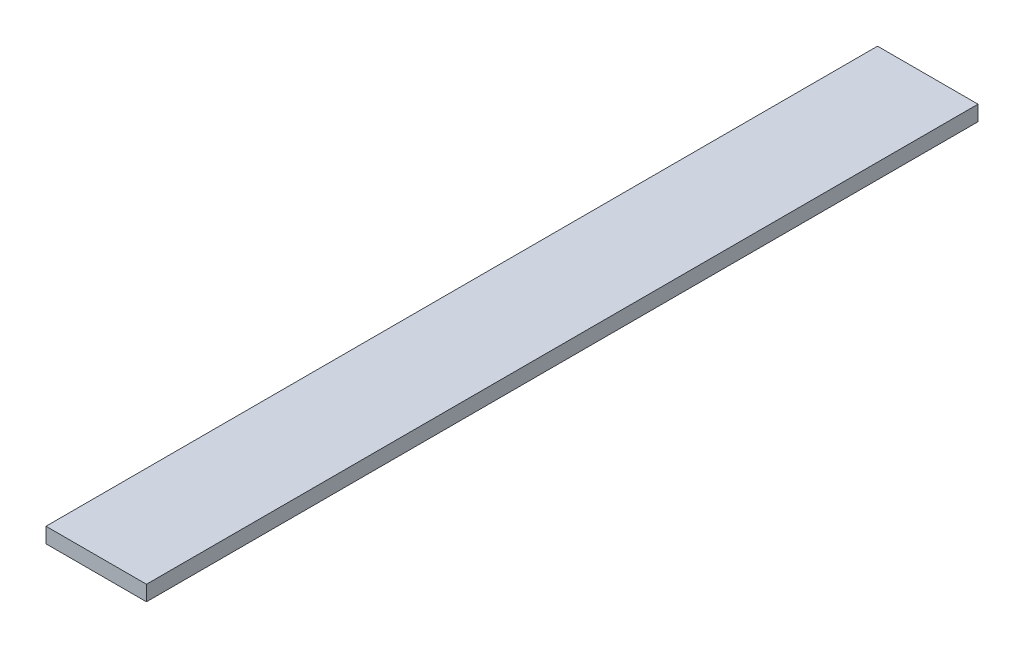
ISO-10303-21;
HEADER;
FILE_DESCRIPTION(('STEP AP214'),'2;1');
FILE_NAME('part.step','',(''),(''),'','','');
FILE_SCHEMA(('AUTOMOTIVE_DESIGN { 1 0 10303 214 1 1 1 1 }'));
ENDSEC;
DATA;
#1=APPLICATION_CONTEXT('core data for automotive mechanical design processes');
#2=APPLICATION_PROTOCOL_DEFINITION('international standard','automotive_design',2000,#1);
#3=PRODUCT_CONTEXT('',#1,'mechanical');
#4=PRODUCT('Part','Part','',(#3));
#5=PRODUCT_RELATED_PRODUCT_CATEGORY('part','',(#4));
#6=PRODUCT_DEFINITION_FORMATION('','',#4);
#7=PRODUCT_DEFINITION_CONTEXT('part definition',#1,'design');
#8=PRODUCT_DEFINITION('design','',#6,#7);
#9=PRODUCT_DEFINITION_SHAPE('','',#8);
#10=(LENGTH_UNIT() NAMED_UNIT(*) SI_UNIT(.MILLI.,.METRE.));
#11=(NAMED_UNIT(*) PLANE_ANGLE_UNIT() SI_UNIT($,.RADIAN.));
#12=(NAMED_UNIT(*) SI_UNIT($,.STERADIAN.) SOLID_ANGLE_UNIT());
#13=UNCERTAINTY_MEASURE_WITH_UNIT(LENGTH_MEASURE(1.E-05),#10,'distance_accuracy_value','');
#14=(GEOMETRIC_REPRESENTATION_CONTEXT(3) GLOBAL_UNCERTAINTY_ASSIGNED_CONTEXT((#13)) GLOBAL_UNIT_ASSIGNED_CONTEXT((#10,
#11,#12)) REPRESENTATION_CONTEXT('',''));
#15=CARTESIAN_POINT('',(0.,0.,0.));
#16=DIRECTION('',(0.,0.,1.));
#17=DIRECTION('',(1.,0.,0.));
#18=AXIS2_PLACEMENT_3D('',#15,#16,#17);
#19=CARTESIAN_POINT('',(72.5,22.,600.));
#20=DIRECTION('',(-1.,0.,0.));
#21=DIRECTION('',(0.,0.,1.));
#22=AXIS2_PLACEMENT_3D('',#19,#20,#21);
#23=PLANE('',#22);
#24=DIRECTION('',(0.,0.,-1.));
#25=VECTOR('',#24,1.);
#26=CARTESIAN_POINT('',(72.5,0.,600.));
#27=LINE('',#26,#25);
#28=CARTESIAN_POINT('',(72.5,0.,600.));
#29=VERTEX_POINT('',#28);
#30=CARTESIAN_POINT('',(72.5,0.,-600.));
#31=VERTEX_POINT('',#30);
#32=EDGE_CURVE('E105',#29,#31,#27,.T.);
#33=ORIENTED_EDGE('',*,*,#32,.T.);
#34=DIRECTION('',(0.,-1.,0.));
#35=VECTOR('',#34,1.);
#36=CARTESIAN_POINT('',(72.5,22.,-600.));
#37=LINE('',#36,#35);
#38=CARTESIAN_POINT('',(72.5,22.,-600.));
#39=VERTEX_POINT('',#38);
#40=EDGE_CURVE('E11',#39,#31,#37,.T.);
#41=ORIENTED_EDGE('',*,*,#40,.F.);
#42=DIRECTION('',(0.,0.,-1.));
#43=VECTOR('',#42,1.);
#44=CARTESIAN_POINT('',(72.5,22.,600.));
#45=LINE('',#44,#43);
#46=CARTESIAN_POINT('',(72.5,22.,600.));
#47=VERTEX_POINT('',#46);
#48=EDGE_CURVE('E88',#47,#39,#45,.T.);
#49=ORIENTED_EDGE('',*,*,#48,.F.);
#50=DIRECTION('',(0.,-1.,0.));
#51=VECTOR('',#50,1.);
#52=CARTESIAN_POINT('',(72.5,22.,600.));
#53=LINE('',#52,#51);
#54=EDGE_CURVE('E101',#47,#29,#53,.T.);
#55=ORIENTED_EDGE('',*,*,#54,.T.);
#56=EDGE_LOOP('',(#33,#41,#49,#55));
#57=FACE_BOUND('',#56,.T.);
#58=ADVANCED_FACE('F36',(#57),#23,.F.);
#59=CARTESIAN_POINT('',(-72.5,22.,-600.));
#60=DIRECTION('',(0.,0.,1.));
#61=DIRECTION('',(1.,0.,0.));
#62=AXIS2_PLACEMENT_3D('',#59,#60,#61);
#63=PLANE('',#62);
#64=DIRECTION('',(-1.,0.,0.));
#65=VECTOR('',#64,1.);
#66=CARTESIAN_POINT('',(-72.5,0.,-600.));
#67=LINE('',#66,#65);
#68=CARTESIAN_POINT('',(-72.5,0.,-600.));
#69=VERTEX_POINT('',#68);
#70=EDGE_CURVE('E93',#31,#69,#67,.T.);
#71=ORIENTED_EDGE('',*,*,#70,.T.);
#72=DIRECTION('',(0.,-1.,0.));
#73=VECTOR('',#72,1.);
#74=CARTESIAN_POINT('',(-72.5,22.,-600.));
#75=LINE('',#74,#73);
#76=CARTESIAN_POINT('',(-72.5,22.,-600.));
#77=VERTEX_POINT('',#76);
#78=EDGE_CURVE('E45',#77,#69,#75,.T.);
#79=ORIENTED_EDGE('',*,*,#78,.F.);
#80=DIRECTION('',(-1.,0.,0.));
#81=VECTOR('',#80,1.);
#82=CARTESIAN_POINT('',(-72.5,22.,-600.));
#83=LINE('',#82,#81);
#84=EDGE_CURVE('E83',#39,#77,#83,.T.);
#85=ORIENTED_EDGE('',*,*,#84,.F.);
#86=ORIENTED_EDGE('',*,*,#40,.T.);
#87=EDGE_LOOP('',(#71,#79,#85,#86));
#88=FACE_BOUND('',#87,.T.);
#89=ADVANCED_FACE('F92',(#88),#63,.F.);
#90=CARTESIAN_POINT('',(-72.5,22.,600.));
#91=DIRECTION('',(1.,0.,0.));
#92=DIRECTION('',(0.,0.,-1.));
#93=AXIS2_PLACEMENT_3D('',#90,#91,#92);
#94=PLANE('',#93);
#95=DIRECTION('',(0.,0.,1.));
#96=VECTOR('',#95,1.);
#97=CARTESIAN_POINT('',(-72.5,0.,600.));
#98=LINE('',#97,#96);
#99=CARTESIAN_POINT('',(-72.5,0.,600.));
#100=VERTEX_POINT('',#99);
#101=EDGE_CURVE('E70',#69,#100,#98,.T.);
#102=ORIENTED_EDGE('',*,*,#101,.T.);
#103=DIRECTION('',(0.,-1.,0.));
#104=VECTOR('',#103,1.);
#105=CARTESIAN_POINT('',(-72.5,22.,600.));
#106=LINE('',#105,#104);
#107=CARTESIAN_POINT('',(-72.5,22.,600.));
#108=VERTEX_POINT('',#107);
#109=EDGE_CURVE('E95',#108,#100,#106,.T.);
#110=ORIENTED_EDGE('',*,*,#109,.F.);
#111=DIRECTION('',(0.,0.,1.));
#112=VECTOR('',#111,1.);
#113=CARTESIAN_POINT('',(-72.5,22.,600.));
#114=LINE('',#113,#112);
#115=EDGE_CURVE('E86',#77,#108,#114,.T.);
#116=ORIENTED_EDGE('',*,*,#115,.F.);
#117=ORIENTED_EDGE('',*,*,#78,.T.);
#118=EDGE_LOOP('',(#102,#110,#116,#117));
#119=FACE_BOUND('',#118,.T.);
#120=ADVANCED_FACE('F96',(#119),#94,.F.);
#121=CARTESIAN_POINT('',(-72.5,22.,600.));
#122=DIRECTION('',(0.,0.,-1.));
#123=DIRECTION('',(-1.,0.,0.));
#124=AXIS2_PLACEMENT_3D('',#121,#122,#123);
#125=PLANE('',#124);
#126=DIRECTION('',(1.,0.,0.));
#127=VECTOR('',#126,1.);
#128=CARTESIAN_POINT('',(-72.5,0.,600.));
#129=LINE('',#128,#127);
#130=EDGE_CURVE('E76',#100,#29,#129,.T.);
#131=ORIENTED_EDGE('',*,*,#130,.T.);
#132=ORIENTED_EDGE('',*,*,#54,.F.);
#133=DIRECTION('',(1.,0.,0.));
#134=VECTOR('',#133,1.);
#135=CARTESIAN_POINT('',(-72.5,22.,600.));
#136=LINE('',#135,#134);
#137=EDGE_CURVE('E53',#108,#47,#136,.T.);
#138=ORIENTED_EDGE('',*,*,#137,.F.);
#139=ORIENTED_EDGE('',*,*,#109,.T.);
#140=EDGE_LOOP('',(#131,#132,#138,#139));
#141=FACE_BOUND('',#140,.T.);
#142=ADVANCED_FACE('F118',(#141),#125,.F.);
#143=CARTESIAN_POINT('',(0.,22.,0.));
#144=DIRECTION('',(0.,-1.,0.));
#145=DIRECTION('',(0.,0.,-1.));
#146=AXIS2_PLACEMENT_3D('',#143,#144,#145);
#147=PLANE('',#146);
#148=ORIENTED_EDGE('',*,*,#48,.T.);
#149=ORIENTED_EDGE('',*,*,#84,.T.);
#150=ORIENTED_EDGE('',*,*,#115,.T.);
#151=ORIENTED_EDGE('',*,*,#137,.T.);
#152=EDGE_LOOP('',(#148,#149,#150,#151));
#153=FACE_BOUND('',#152,.T.);
#154=ADVANCED_FACE('F84',(#153),#147,.F.);
#155=CARTESIAN_POINT('',(0.,0.,0.));
#156=DIRECTION('',(0.,-1.,0.));
#157=DIRECTION('',(0.,0.,-1.));
#158=AXIS2_PLACEMENT_3D('',#155,#156,#157);
#159=PLANE('',#158);
#160=ORIENTED_EDGE('',*,*,#32,.F.);
#161=ORIENTED_EDGE('',*,*,#130,.F.);
#162=ORIENTED_EDGE('',*,*,#101,.F.);
#163=ORIENTED_EDGE('',*,*,#70,.F.);
#164=EDGE_LOOP('',(#160,#161,#162,#163));
#165=FACE_BOUND('',#164,.T.);
#166=ADVANCED_FACE('F121',(#165),#159,.T.);
#167=CLOSED_SHELL('',(#58,#89,#120,#142,#154,#166));
#168=MANIFOLD_SOLID_BREP('B2',#167);
#169=ADVANCED_BREP_SHAPE_REPRESENTATION('',(#18,#168),#14);
#170=SHAPE_DEFINITION_REPRESENTATION(#9,#169);
ENDSEC;
END-ISO-10303-21;
